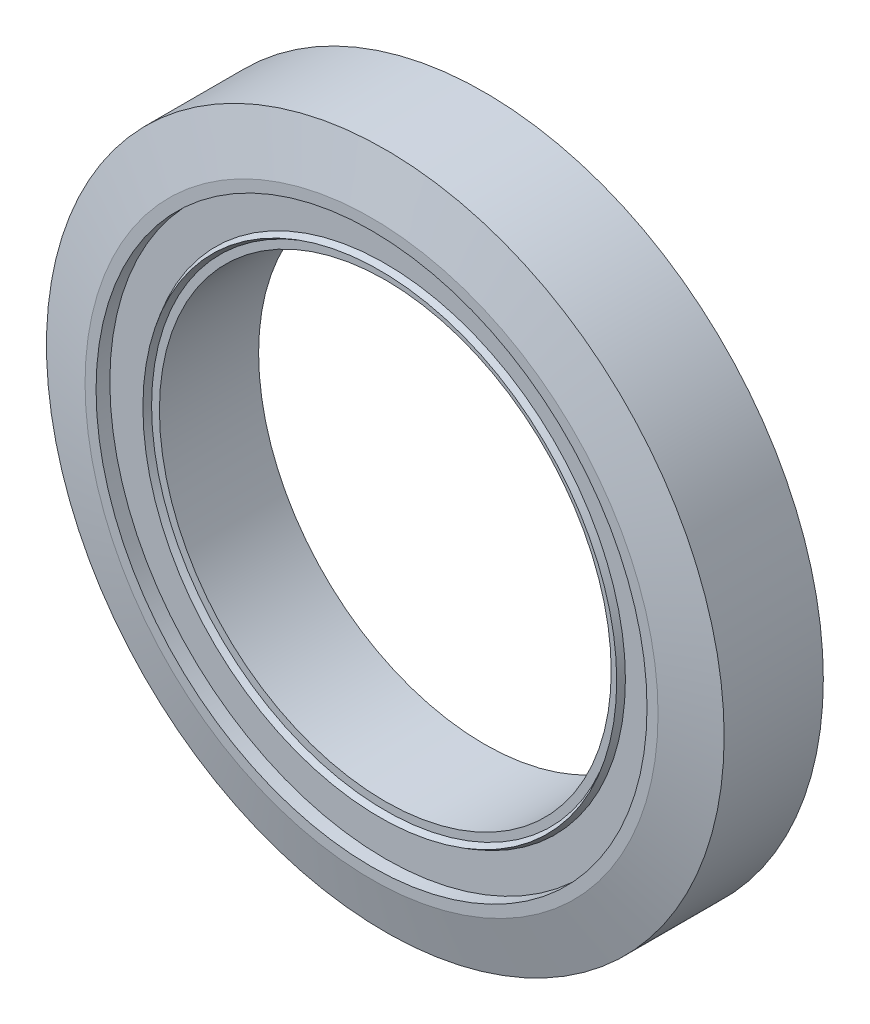
ISO-10303-21;
HEADER;
FILE_DESCRIPTION(('STEP AP214'),'2;1');
FILE_NAME('part.step','',(''),(''),'','','');
FILE_SCHEMA(('AUTOMOTIVE_DESIGN { 1 0 10303 214 1 1 1 1 }'));
ENDSEC;
DATA;
#1=APPLICATION_CONTEXT('core data for automotive mechanical design processes');
#2=APPLICATION_PROTOCOL_DEFINITION('international standard','automotive_design',2000,#1);
#3=PRODUCT_CONTEXT('',#1,'mechanical');
#4=PRODUCT('Part','Part','',(#3));
#5=PRODUCT_RELATED_PRODUCT_CATEGORY('part','',(#4));
#6=PRODUCT_DEFINITION_FORMATION('','',#4);
#7=PRODUCT_DEFINITION_CONTEXT('part definition',#1,'design');
#8=PRODUCT_DEFINITION('design','',#6,#7);
#9=PRODUCT_DEFINITION_SHAPE('','',#8);
#10=(LENGTH_UNIT() NAMED_UNIT(*) SI_UNIT(.MILLI.,.METRE.));
#11=(NAMED_UNIT(*) PLANE_ANGLE_UNIT() SI_UNIT($,.RADIAN.));
#12=(NAMED_UNIT(*) SI_UNIT($,.STERADIAN.) SOLID_ANGLE_UNIT());
#13=UNCERTAINTY_MEASURE_WITH_UNIT(LENGTH_MEASURE(1.E-05),#10,'distance_accuracy_value','');
#14=(GEOMETRIC_REPRESENTATION_CONTEXT(3) GLOBAL_UNCERTAINTY_ASSIGNED_CONTEXT((#13)) GLOBAL_UNIT_ASSIGNED_CONTEXT((#10,
#11,#12)) REPRESENTATION_CONTEXT('',''));
#15=CARTESIAN_POINT('',(0.,0.,0.));
#16=DIRECTION('',(0.,0.,1.));
#17=DIRECTION('',(1.,0.,0.));
#18=AXIS2_PLACEMENT_3D('',#15,#16,#17);
#19=CARTESIAN_POINT('',(0.,0.,0.9));
#20=DIRECTION('',(0.,0.,-1.));
#21=DIRECTION('',(-1.,0.,0.));
#22=AXIS2_PLACEMENT_3D('',#19,#20,#21);
#23=CONICAL_SURFACE('',#22,6.15,1.31347261182381);
#24=CARTESIAN_POINT('',(0.,0.,1.15));
#25=DIRECTION('',(0.,0.,1.));
#26=DIRECTION('',(1.,0.,0.));
#27=AXIS2_PLACEMENT_3D('',#24,#25,#26);
#28=CIRCLE('',#27,5.2);
#29=CARTESIAN_POINT('',(5.2,0.,1.15));
#30=VERTEX_POINT('',#29);
#31=EDGE_CURVE('E93',#30,#30,#28,.T.);
#32=ORIENTED_EDGE('',*,*,#31,.F.);
#33=EDGE_LOOP('',(#32));
#34=FACE_BOUND('',#33,.T.);
#35=CARTESIAN_POINT('',(0.,0.,0.9));
#36=DIRECTION('',(0.,0.,1.));
#37=DIRECTION('',(1.,0.,0.));
#38=AXIS2_PLACEMENT_3D('',#35,#36,#37);
#39=CIRCLE('',#38,6.15);
#40=CARTESIAN_POINT('',(6.15,0.,0.9));
#41=VERTEX_POINT('',#40);
#42=EDGE_CURVE('E10',#41,#41,#39,.T.);
#43=ORIENTED_EDGE('',*,*,#42,.T.);
#44=EDGE_LOOP('',(#43));
#45=FACE_BOUND('',#44,.T.);
#46=ADVANCED_FACE('F41',(#34,#45),#23,.T.);
#47=CARTESIAN_POINT('',(0.,0.,0.));
#48=DIRECTION('',(0.,0.,1.));
#49=DIRECTION('',(1.,0.,0.));
#50=AXIS2_PLACEMENT_3D('',#47,#48,#49);
#51=CYLINDRICAL_SURFACE('',#50,6.15);
#52=ORIENTED_EDGE('',*,*,#42,.F.);
#53=EDGE_LOOP('',(#52));
#54=FACE_BOUND('',#53,.T.);
#55=CARTESIAN_POINT('',(0.,0.,-0.9));
#56=DIRECTION('',(0.,0.,1.));
#57=DIRECTION('',(1.,0.,0.));
#58=AXIS2_PLACEMENT_3D('',#55,#56,#57);
#59=CIRCLE('',#58,6.15);
#60=CARTESIAN_POINT('',(6.15,0.,-0.9));
#61=VERTEX_POINT('',#60);
#62=EDGE_CURVE('E47',#61,#61,#59,.T.);
#63=ORIENTED_EDGE('',*,*,#62,.T.);
#64=EDGE_LOOP('',(#63));
#65=FACE_BOUND('',#64,.T.);
#66=ADVANCED_FACE('F100',(#54,#65),#51,.T.);
#67=CARTESIAN_POINT('',(0.,0.,-1.15));
#68=DIRECTION('',(0.,0.,1.));
#69=DIRECTION('',(1.,0.,0.));
#70=AXIS2_PLACEMENT_3D('',#67,#68,#69);
#71=CONICAL_SURFACE('',#70,5.2,1.31347261182381);
#72=ORIENTED_EDGE('',*,*,#62,.F.);
#73=EDGE_LOOP('',(#72));
#74=FACE_BOUND('',#73,.T.);
#75=CARTESIAN_POINT('',(0.,0.,-1.15));
#76=DIRECTION('',(0.,0.,1.));
#77=DIRECTION('',(1.,0.,0.));
#78=AXIS2_PLACEMENT_3D('',#75,#76,#77);
#79=CIRCLE('',#78,5.2);
#80=CARTESIAN_POINT('',(5.2,0.,-1.15));
#81=VERTEX_POINT('',#80);
#82=EDGE_CURVE('E51',#81,#81,#79,.T.);
#83=ORIENTED_EDGE('',*,*,#82,.T.);
#84=EDGE_LOOP('',(#83));
#85=FACE_BOUND('',#84,.T.);
#86=ADVANCED_FACE('F104',(#74,#85),#71,.T.);
#87=CARTESIAN_POINT('',(0.,5.,-1.15));
#88=DIRECTION('',(0.,0.,1.));
#89=DIRECTION('',(1.,0.,0.));
#90=AXIS2_PLACEMENT_3D('',#87,#88,#89);
#91=PLANE('',#90);
#92=ORIENTED_EDGE('',*,*,#82,.F.);
#93=EDGE_LOOP('',(#92));
#94=FACE_BOUND('',#93,.T.);
#95=CARTESIAN_POINT('',(0.,0.,-1.15));
#96=DIRECTION('',(0.,0.,1.));
#97=DIRECTION('',(1.,0.,0.));
#98=AXIS2_PLACEMENT_3D('',#95,#96,#97);
#99=CIRCLE('',#98,5.);
#100=CARTESIAN_POINT('',(5.,0.,-1.15));
#101=VERTEX_POINT('',#100);
#102=EDGE_CURVE('E55',#101,#101,#99,.T.);
#103=ORIENTED_EDGE('',*,*,#102,.T.);
#104=EDGE_LOOP('',(#103));
#105=FACE_BOUND('',#104,.T.);
#106=ADVANCED_FACE('F109',(#94,#105),#91,.F.);
#107=CARTESIAN_POINT('',(0.,0.,0.));
#108=DIRECTION('',(0.,0.,1.));
#109=DIRECTION('',(1.,0.,0.));
#110=AXIS2_PLACEMENT_3D('',#107,#108,#109);
#111=CYLINDRICAL_SURFACE('',#110,5.);
#112=ORIENTED_EDGE('',*,*,#102,.F.);
#113=EDGE_LOOP('',(#112));
#114=FACE_BOUND('',#113,.T.);
#115=CARTESIAN_POINT('',(0.,0.,-0.9));
#116=DIRECTION('',(0.,0.,1.));
#117=DIRECTION('',(1.,0.,0.));
#118=AXIS2_PLACEMENT_3D('',#115,#116,#117);
#119=CIRCLE('',#118,5.);
#120=CARTESIAN_POINT('',(5.,0.,-0.9));
#121=VERTEX_POINT('',#120);
#122=EDGE_CURVE('E60',#121,#121,#119,.T.);
#123=ORIENTED_EDGE('',*,*,#122,.T.);
#124=EDGE_LOOP('',(#123));
#125=FACE_BOUND('',#124,.T.);
#126=ADVANCED_FACE('F115',(#114,#125),#111,.F.);
#127=CARTESIAN_POINT('',(0.,5.,-0.9));
#128=DIRECTION('',(0.,0.,1.));
#129=DIRECTION('',(1.,0.,0.));
#130=AXIS2_PLACEMENT_3D('',#127,#128,#129);
#131=PLANE('',#130);
#132=ORIENTED_EDGE('',*,*,#122,.F.);
#133=EDGE_LOOP('',(#132));
#134=FACE_BOUND('',#133,.T.);
#135=CARTESIAN_POINT('',(0.,0.,-0.9));
#136=DIRECTION('',(0.,0.,1.));
#137=DIRECTION('',(1.,0.,0.));
#138=AXIS2_PLACEMENT_3D('',#135,#136,#137);
#139=CIRCLE('',#138,4.35773502691896);
#140=CARTESIAN_POINT('',(4.35773502691896,0.,-0.9));
#141=VERTEX_POINT('',#140);
#142=EDGE_CURVE('E63',#141,#141,#139,.T.);
#143=ORIENTED_EDGE('',*,*,#142,.T.);
#144=EDGE_LOOP('',(#143));
#145=FACE_BOUND('',#144,.T.);
#146=ADVANCED_FACE('F119',(#134,#145),#131,.F.);
#147=CARTESIAN_POINT('',(0.,0.,-1.));
#148=DIRECTION('',(0.,0.,1.));
#149=DIRECTION('',(1.,0.,0.));
#150=AXIS2_PLACEMENT_3D('',#147,#148,#149);
#151=CONICAL_SURFACE('',#150,4.3,0.523598775598298);
#152=ORIENTED_EDGE('',*,*,#142,.F.);
#153=EDGE_LOOP('',(#152));
#154=FACE_BOUND('',#153,.T.);
#155=CARTESIAN_POINT('',(0.,0.,-1.));
#156=DIRECTION('',(0.,0.,1.));
#157=DIRECTION('',(1.,0.,0.));
#158=AXIS2_PLACEMENT_3D('',#155,#156,#157);
#159=CIRCLE('',#158,4.3);
#160=CARTESIAN_POINT('',(4.3,0.,-1.));
#161=VERTEX_POINT('',#160);
#162=EDGE_CURVE('E66',#161,#161,#159,.T.);
#163=ORIENTED_EDGE('',*,*,#162,.T.);
#164=EDGE_LOOP('',(#163));
#165=FACE_BOUND('',#164,.T.);
#166=ADVANCED_FACE('F123',(#154,#165),#151,.T.);
#167=CARTESIAN_POINT('',(0.,0.,-0.9));
#168=DIRECTION('',(0.,0.,-1.));
#169=DIRECTION('',(-1.,0.,0.));
#170=AXIS2_PLACEMENT_3D('',#167,#168,#169);
#171=CONICAL_SURFACE('',#170,4.24226497308104,0.523598775598298);
#172=ORIENTED_EDGE('',*,*,#162,.F.);
#173=EDGE_LOOP('',(#172));
#174=FACE_BOUND('',#173,.T.);
#175=CARTESIAN_POINT('',(0.,0.,-0.9));
#176=DIRECTION('',(0.,0.,1.));
#177=DIRECTION('',(1.,0.,0.));
#178=AXIS2_PLACEMENT_3D('',#175,#176,#177);
#179=CIRCLE('',#178,4.24226497308104);
#180=CARTESIAN_POINT('',(4.24226497308104,0.,-0.9));
#181=VERTEX_POINT('',#180);
#182=EDGE_CURVE('E69',#181,#181,#179,.T.);
#183=ORIENTED_EDGE('',*,*,#182,.T.);
#184=EDGE_LOOP('',(#183));
#185=FACE_BOUND('',#184,.T.);
#186=ADVANCED_FACE('F127',(#174,#185),#171,.F.);
#187=CARTESIAN_POINT('',(0.,4.24226497308104,-0.9));
#188=DIRECTION('',(0.,0.,1.));
#189=DIRECTION('',(1.,0.,0.));
#190=AXIS2_PLACEMENT_3D('',#187,#188,#189);
#191=PLANE('',#190);
#192=ORIENTED_EDGE('',*,*,#182,.F.);
#193=EDGE_LOOP('',(#192));
#194=FACE_BOUND('',#193,.T.);
#195=CARTESIAN_POINT('',(0.,0.,-0.9));
#196=DIRECTION('',(0.,0.,1.));
#197=DIRECTION('',(1.,0.,0.));
#198=AXIS2_PLACEMENT_3D('',#195,#196,#197);
#199=CIRCLE('',#198,4.1);
#200=CARTESIAN_POINT('',(4.1,0.,-0.9));
#201=VERTEX_POINT('',#200);
#202=EDGE_CURVE('E72',#201,#201,#199,.T.);
#203=ORIENTED_EDGE('',*,*,#202,.T.);
#204=EDGE_LOOP('',(#203));
#205=FACE_BOUND('',#204,.T.);
#206=ADVANCED_FACE('F131',(#194,#205),#191,.F.);
#207=CARTESIAN_POINT('',(0.,0.,0.));
#208=DIRECTION('',(0.,0.,1.));
#209=DIRECTION('',(1.,0.,0.));
#210=AXIS2_PLACEMENT_3D('',#207,#208,#209);
#211=CYLINDRICAL_SURFACE('',#210,4.1);
#212=ORIENTED_EDGE('',*,*,#202,.F.);
#213=EDGE_LOOP('',(#212));
#214=FACE_BOUND('',#213,.T.);
#215=CARTESIAN_POINT('',(0.,0.,0.9));
#216=DIRECTION('',(0.,0.,1.));
#217=DIRECTION('',(1.,0.,0.));
#218=AXIS2_PLACEMENT_3D('',#215,#216,#217);
#219=CIRCLE('',#218,4.1);
#220=CARTESIAN_POINT('',(4.1,0.,0.9));
#221=VERTEX_POINT('',#220);
#222=EDGE_CURVE('E75',#221,#221,#219,.T.);
#223=ORIENTED_EDGE('',*,*,#222,.T.);
#224=EDGE_LOOP('',(#223));
#225=FACE_BOUND('',#224,.T.);
#226=ADVANCED_FACE('F135',(#214,#225),#211,.F.);
#227=CARTESIAN_POINT('',(0.,4.24226497308104,0.9));
#228=DIRECTION('',(0.,0.,-1.));
#229=DIRECTION('',(-1.,0.,0.));
#230=AXIS2_PLACEMENT_3D('',#227,#228,#229);
#231=PLANE('',#230);
#232=ORIENTED_EDGE('',*,*,#222,.F.);
#233=EDGE_LOOP('',(#232));
#234=FACE_BOUND('',#233,.T.);
#235=CARTESIAN_POINT('',(0.,0.,0.9));
#236=DIRECTION('',(0.,0.,1.));
#237=DIRECTION('',(1.,0.,0.));
#238=AXIS2_PLACEMENT_3D('',#235,#236,#237);
#239=CIRCLE('',#238,4.24226497308104);
#240=CARTESIAN_POINT('',(4.24226497308104,0.,0.9));
#241=VERTEX_POINT('',#240);
#242=EDGE_CURVE('E78',#241,#241,#239,.T.);
#243=ORIENTED_EDGE('',*,*,#242,.T.);
#244=EDGE_LOOP('',(#243));
#245=FACE_BOUND('',#244,.T.);
#246=ADVANCED_FACE('F139',(#234,#245),#231,.F.);
#247=CARTESIAN_POINT('',(0.,0.,1.));
#248=DIRECTION('',(0.,0.,1.));
#249=DIRECTION('',(1.,0.,0.));
#250=AXIS2_PLACEMENT_3D('',#247,#248,#249);
#251=CONICAL_SURFACE('',#250,4.3,0.523598775598298);
#252=ORIENTED_EDGE('',*,*,#242,.F.);
#253=EDGE_LOOP('',(#252));
#254=FACE_BOUND('',#253,.T.);
#255=CARTESIAN_POINT('',(0.,0.,1.));
#256=DIRECTION('',(0.,0.,1.));
#257=DIRECTION('',(1.,0.,0.));
#258=AXIS2_PLACEMENT_3D('',#255,#256,#257);
#259=CIRCLE('',#258,4.3);
#260=CARTESIAN_POINT('',(4.3,0.,1.));
#261=VERTEX_POINT('',#260);
#262=EDGE_CURVE('E81',#261,#261,#259,.T.);
#263=ORIENTED_EDGE('',*,*,#262,.T.);
#264=EDGE_LOOP('',(#263));
#265=FACE_BOUND('',#264,.T.);
#266=ADVANCED_FACE('F143',(#254,#265),#251,.F.);
#267=CARTESIAN_POINT('',(0.,0.,0.9));
#268=DIRECTION('',(0.,0.,-1.));
#269=DIRECTION('',(-1.,0.,0.));
#270=AXIS2_PLACEMENT_3D('',#267,#268,#269);
#271=CONICAL_SURFACE('',#270,4.35773502691896,0.523598775598298);
#272=ORIENTED_EDGE('',*,*,#262,.F.);
#273=EDGE_LOOP('',(#272));
#274=FACE_BOUND('',#273,.T.);
#275=CARTESIAN_POINT('',(0.,0.,0.9));
#276=DIRECTION('',(0.,0.,1.));
#277=DIRECTION('',(1.,0.,0.));
#278=AXIS2_PLACEMENT_3D('',#275,#276,#277);
#279=CIRCLE('',#278,4.35773502691896);
#280=CARTESIAN_POINT('',(4.35773502691896,0.,0.9));
#281=VERTEX_POINT('',#280);
#282=EDGE_CURVE('E84',#281,#281,#279,.T.);
#283=ORIENTED_EDGE('',*,*,#282,.T.);
#284=EDGE_LOOP('',(#283));
#285=FACE_BOUND('',#284,.T.);
#286=ADVANCED_FACE('F147',(#274,#285),#271,.T.);
#287=CARTESIAN_POINT('',(0.,5.,0.9));
#288=DIRECTION('',(0.,0.,-1.));
#289=DIRECTION('',(-1.,0.,0.));
#290=AXIS2_PLACEMENT_3D('',#287,#288,#289);
#291=PLANE('',#290);
#292=ORIENTED_EDGE('',*,*,#282,.F.);
#293=EDGE_LOOP('',(#292));
#294=FACE_BOUND('',#293,.T.);
#295=CARTESIAN_POINT('',(0.,0.,0.9));
#296=DIRECTION('',(0.,0.,1.));
#297=DIRECTION('',(1.,0.,0.));
#298=AXIS2_PLACEMENT_3D('',#295,#296,#297);
#299=CIRCLE('',#298,5.);
#300=CARTESIAN_POINT('',(5.,0.,0.9));
#301=VERTEX_POINT('',#300);
#302=EDGE_CURVE('E87',#301,#301,#299,.T.);
#303=ORIENTED_EDGE('',*,*,#302,.T.);
#304=EDGE_LOOP('',(#303));
#305=FACE_BOUND('',#304,.T.);
#306=ADVANCED_FACE('F151',(#294,#305),#291,.F.);
#307=CARTESIAN_POINT('',(0.,0.,0.));
#308=DIRECTION('',(0.,0.,1.));
#309=DIRECTION('',(1.,0.,0.));
#310=AXIS2_PLACEMENT_3D('',#307,#308,#309);
#311=CYLINDRICAL_SURFACE('',#310,5.);
#312=ORIENTED_EDGE('',*,*,#302,.F.);
#313=EDGE_LOOP('',(#312));
#314=FACE_BOUND('',#313,.T.);
#315=CARTESIAN_POINT('',(0.,0.,1.15));
#316=DIRECTION('',(0.,0.,1.));
#317=DIRECTION('',(1.,0.,0.));
#318=AXIS2_PLACEMENT_3D('',#315,#316,#317);
#319=CIRCLE('',#318,5.);
#320=CARTESIAN_POINT('',(5.,0.,1.15));
#321=VERTEX_POINT('',#320);
#322=EDGE_CURVE('E90',#321,#321,#319,.T.);
#323=ORIENTED_EDGE('',*,*,#322,.T.);
#324=EDGE_LOOP('',(#323));
#325=FACE_BOUND('',#324,.T.);
#326=ADVANCED_FACE('F155',(#314,#325),#311,.F.);
#327=CARTESIAN_POINT('',(0.,5.,1.15));
#328=DIRECTION('',(0.,0.,-1.));
#329=DIRECTION('',(-1.,0.,0.));
#330=AXIS2_PLACEMENT_3D('',#327,#328,#329);
#331=PLANE('',#330);
#332=ORIENTED_EDGE('',*,*,#322,.F.);
#333=EDGE_LOOP('',(#332));
#334=FACE_BOUND('',#333,.T.);
#335=ORIENTED_EDGE('',*,*,#31,.T.);
#336=EDGE_LOOP('',(#335));
#337=FACE_BOUND('',#336,.T.);
#338=ADVANCED_FACE('F97',(#334,#337),#331,.F.);
#339=CLOSED_SHELL('',(#46,#66,#86,#106,#126,#146,#166,#186,#206,#226,#246,#266,#286,#306,#326,#338));
#340=MANIFOLD_SOLID_BREP('B2',#339);
#341=ADVANCED_BREP_SHAPE_REPRESENTATION('',(#18,#340),#14);
#342=SHAPE_DEFINITION_REPRESENTATION(#9,#341);
ENDSEC;
END-ISO-10303-21;
